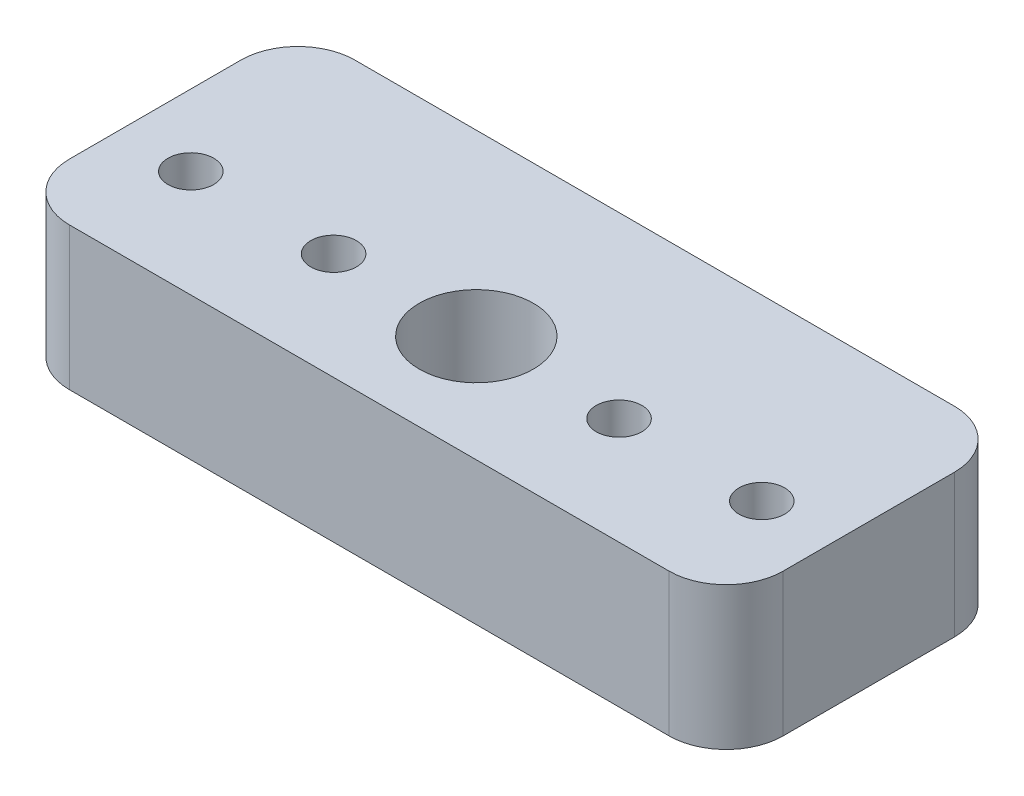
ISO-10303-21;
HEADER;
FILE_DESCRIPTION(('STEP AP214'),'2;1');
FILE_NAME('part.step','',(''),(''),'','','');
FILE_SCHEMA(('AUTOMOTIVE_DESIGN { 1 0 10303 214 1 1 1 1 }'));
ENDSEC;
DATA;
#1=APPLICATION_CONTEXT('core data for automotive mechanical design processes');
#2=APPLICATION_PROTOCOL_DEFINITION('international standard','automotive_design',2000,#1);
#3=PRODUCT_CONTEXT('',#1,'mechanical');
#4=PRODUCT('Part','Part','',(#3));
#5=PRODUCT_RELATED_PRODUCT_CATEGORY('part','',(#4));
#6=PRODUCT_DEFINITION_FORMATION('','',#4);
#7=PRODUCT_DEFINITION_CONTEXT('part definition',#1,'design');
#8=PRODUCT_DEFINITION('design','',#6,#7);
#9=PRODUCT_DEFINITION_SHAPE('','',#8);
#10=(LENGTH_UNIT() NAMED_UNIT(*) SI_UNIT(.MILLI.,.METRE.));
#11=(NAMED_UNIT(*) PLANE_ANGLE_UNIT() SI_UNIT($,.RADIAN.));
#12=(NAMED_UNIT(*) SI_UNIT($,.STERADIAN.) SOLID_ANGLE_UNIT());
#13=UNCERTAINTY_MEASURE_WITH_UNIT(LENGTH_MEASURE(1.E-05),#10,'distance_accuracy_value','');
#14=(GEOMETRIC_REPRESENTATION_CONTEXT(3) GLOBAL_UNCERTAINTY_ASSIGNED_CONTEXT((#13)) GLOBAL_UNIT_ASSIGNED_CONTEXT((#10,
#11,#12)) REPRESENTATION_CONTEXT('',''));
#15=CARTESIAN_POINT('',(0.,0.,0.));
#16=DIRECTION('',(0.,0.,1.));
#17=DIRECTION('',(1.,0.,0.));
#18=AXIS2_PLACEMENT_3D('',#15,#16,#17);
#19=CARTESIAN_POINT('',(-21.,10.,6.00000000000001));
#20=DIRECTION('',(0.,1.,0.));
#21=DIRECTION('',(0.,0.,1.));
#22=AXIS2_PLACEMENT_3D('',#19,#20,#21);
#23=PLANE('',#22);
#24=CARTESIAN_POINT('',(-20.,10.,2.5));
#25=DIRECTION('',(0.,1.,0.));
#26=DIRECTION('',(0.,0.,-1.));
#27=AXIS2_PLACEMENT_3D('',#24,#25,#26);
#28=CIRCLE('',#27,1.6);
#29=CARTESIAN_POINT('',(-20.,10.,0.900000000000001));
#30=VERTEX_POINT('',#29);
#31=EDGE_CURVE('E194',#30,#30,#28,.T.);
#32=ORIENTED_EDGE('',*,*,#31,.F.);
#33=EDGE_LOOP('',(#32));
#34=FACE_BOUND('',#33,.T.);
#35=CARTESIAN_POINT('',(10.,10.,2.50000000000002));
#36=DIRECTION('',(0.,1.,0.));
#37=DIRECTION('',(0.,0.,1.));
#38=AXIS2_PLACEMENT_3D('',#35,#36,#37);
#39=CIRCLE('',#38,1.6);
#40=CARTESIAN_POINT('',(10.,10.,4.10000000000002));
#41=VERTEX_POINT('',#40);
#42=EDGE_CURVE('E182',#41,#41,#39,.T.);
#43=ORIENTED_EDGE('',*,*,#42,.F.);
#44=EDGE_LOOP('',(#43));
#45=FACE_BOUND('',#44,.T.);
#46=CARTESIAN_POINT('',(-21.,10.,6.00000000000001));
#47=DIRECTION('',(0.,1.,0.));
#48=DIRECTION('',(0.,0.,1.));
#49=AXIS2_PLACEMENT_3D('',#46,#47,#48);
#50=CIRCLE('',#49,4.);
#51=CARTESIAN_POINT('',(-25.,10.,6.00000000000002));
#52=VERTEX_POINT('',#51);
#53=CARTESIAN_POINT('',(-21.,10.,10.));
#54=VERTEX_POINT('',#53);
#55=EDGE_CURVE('E145',#52,#54,#50,.T.);
#56=ORIENTED_EDGE('',*,*,#55,.T.);
#57=DIRECTION('',(1.,0.,0.));
#58=VECTOR('',#57,1.);
#59=CARTESIAN_POINT('',(-21.,10.,10.));
#60=LINE('',#59,#58);
#61=CARTESIAN_POINT('',(21.,10.,10.));
#62=VERTEX_POINT('',#61);
#63=EDGE_CURVE('E93',#54,#62,#60,.T.);
#64=ORIENTED_EDGE('',*,*,#63,.T.);
#65=CARTESIAN_POINT('',(21.,10.,6.00000000000001));
#66=DIRECTION('',(0.,1.,0.));
#67=DIRECTION('',(0.,0.,1.));
#68=AXIS2_PLACEMENT_3D('',#65,#66,#67);
#69=CIRCLE('',#68,4.);
#70=CARTESIAN_POINT('',(25.,10.,6.00000000000002));
#71=VERTEX_POINT('',#70);
#72=EDGE_CURVE('E160',#62,#71,#69,.T.);
#73=ORIENTED_EDGE('',*,*,#72,.T.);
#74=DIRECTION('',(0.,0.,-1.));
#75=VECTOR('',#74,1.);
#76=CARTESIAN_POINT('',(25.,10.,-5.99999999999998));
#77=LINE('',#76,#75);
#78=CARTESIAN_POINT('',(25.,10.,-5.99999999999998));
#79=VERTEX_POINT('',#78);
#80=EDGE_CURVE('E173',#71,#79,#77,.T.);
#81=ORIENTED_EDGE('',*,*,#80,.T.);
#82=CARTESIAN_POINT('',(21.,10.,-5.99999999999998));
#83=DIRECTION('',(0.,1.,0.));
#84=DIRECTION('',(0.,0.,-1.));
#85=AXIS2_PLACEMENT_3D('',#82,#83,#84);
#86=CIRCLE('',#85,4.);
#87=CARTESIAN_POINT('',(21.,10.,-9.99999999999998));
#88=VERTEX_POINT('',#87);
#89=EDGE_CURVE('E112',#79,#88,#86,.T.);
#90=ORIENTED_EDGE('',*,*,#89,.T.);
#91=DIRECTION('',(-1.,0.,0.));
#92=VECTOR('',#91,1.);
#93=CARTESIAN_POINT('',(-21.,10.,-9.99999999999998));
#94=LINE('',#93,#92);
#95=CARTESIAN_POINT('',(-21.,10.,-9.99999999999998));
#96=VERTEX_POINT('',#95);
#97=EDGE_CURVE('E106',#88,#96,#94,.T.);
#98=ORIENTED_EDGE('',*,*,#97,.T.);
#99=CARTESIAN_POINT('',(-21.,10.,-5.99999999999998));
#100=DIRECTION('',(0.,1.,0.));
#101=DIRECTION('',(0.,0.,1.));
#102=AXIS2_PLACEMENT_3D('',#99,#100,#101);
#103=CIRCLE('',#102,4.);
#104=CARTESIAN_POINT('',(-25.,10.,-5.99999999999998));
#105=VERTEX_POINT('',#104);
#106=EDGE_CURVE('E110',#96,#105,#103,.T.);
#107=ORIENTED_EDGE('',*,*,#106,.T.);
#108=DIRECTION('',(0.,0.,1.));
#109=VECTOR('',#108,1.);
#110=CARTESIAN_POINT('',(-25.,10.,-5.99999999999998));
#111=LINE('',#110,#109);
#112=EDGE_CURVE('E50',#105,#52,#111,.T.);
#113=ORIENTED_EDGE('',*,*,#112,.T.);
#114=EDGE_LOOP('',(#56,#64,#73,#81,#90,#98,#107,#113));
#115=FACE_BOUND('',#114,.T.);
#116=CARTESIAN_POINT('',(0.,10.,2.49999999999999));
#117=DIRECTION('',(0.,1.,0.));
#118=DIRECTION('',(0.,0.,1.));
#119=AXIS2_PLACEMENT_3D('',#116,#117,#118);
#120=CIRCLE('',#119,4.);
#121=CARTESIAN_POINT('',(0.,10.,6.49999999999999));
#122=VERTEX_POINT('',#121);
#123=EDGE_CURVE('E134',#122,#122,#120,.T.);
#124=ORIENTED_EDGE('',*,*,#123,.F.);
#125=EDGE_LOOP('',(#124));
#126=FACE_BOUND('',#125,.T.);
#127=CARTESIAN_POINT('',(20.,10.,2.50000000000001));
#128=DIRECTION('',(0.,1.,0.));
#129=DIRECTION('',(0.,0.,1.));
#130=AXIS2_PLACEMENT_3D('',#127,#128,#129);
#131=CIRCLE('',#130,1.60000000000001);
#132=CARTESIAN_POINT('',(20.,10.,4.10000000000002));
#133=VERTEX_POINT('',#132);
#134=EDGE_CURVE('E188',#133,#133,#131,.T.);
#135=ORIENTED_EDGE('',*,*,#134,.F.);
#136=EDGE_LOOP('',(#135));
#137=FACE_BOUND('',#136,.T.);
#138=CARTESIAN_POINT('',(-10.,10.,2.50000000000002));
#139=DIRECTION('',(0.,1.,0.));
#140=DIRECTION('',(0.,0.,-1.));
#141=AXIS2_PLACEMENT_3D('',#138,#139,#140);
#142=CIRCLE('',#141,1.6);
#143=CARTESIAN_POINT('',(-10.,10.,0.900000000000016));
#144=VERTEX_POINT('',#143);
#145=EDGE_CURVE('E200',#144,#144,#142,.T.);
#146=ORIENTED_EDGE('',*,*,#145,.F.);
#147=EDGE_LOOP('',(#146));
#148=FACE_BOUND('',#147,.T.);
#149=ADVANCED_FACE('F33',(#34,#45,#115,#126,#137,#148),#23,.T.);
#150=CARTESIAN_POINT('',(-21.,0.,6.00000000000001));
#151=DIRECTION('',(0.,1.,0.));
#152=DIRECTION('',(0.,0.,1.));
#153=AXIS2_PLACEMENT_3D('',#150,#151,#152);
#154=PLANE('',#153);
#155=CARTESIAN_POINT('',(-21.,0.,6.00000000000001));
#156=DIRECTION('',(0.,1.,0.));
#157=DIRECTION('',(0.,0.,1.));
#158=AXIS2_PLACEMENT_3D('',#155,#156,#157);
#159=CIRCLE('',#158,4.);
#160=CARTESIAN_POINT('',(-25.,0.,6.00000000000002));
#161=VERTEX_POINT('',#160);
#162=CARTESIAN_POINT('',(-21.,0.,10.));
#163=VERTEX_POINT('',#162);
#164=EDGE_CURVE('E130',#161,#163,#159,.T.);
#165=ORIENTED_EDGE('',*,*,#164,.F.);
#166=DIRECTION('',(0.,0.,1.));
#167=VECTOR('',#166,1.);
#168=CARTESIAN_POINT('',(-25.,0.,-5.99999999999998));
#169=LINE('',#168,#167);
#170=CARTESIAN_POINT('',(-25.,0.,-5.99999999999998));
#171=VERTEX_POINT('',#170);
#172=EDGE_CURVE('E85',#171,#161,#169,.T.);
#173=ORIENTED_EDGE('',*,*,#172,.F.);
#174=CARTESIAN_POINT('',(-21.,0.,-5.99999999999998));
#175=DIRECTION('',(0.,1.,0.));
#176=DIRECTION('',(0.,0.,1.));
#177=AXIS2_PLACEMENT_3D('',#174,#175,#176);
#178=CIRCLE('',#177,4.);
#179=CARTESIAN_POINT('',(-21.,0.,-9.99999999999998));
#180=VERTEX_POINT('',#179);
#181=EDGE_CURVE('E79',#180,#171,#178,.T.);
#182=ORIENTED_EDGE('',*,*,#181,.F.);
#183=DIRECTION('',(-1.,0.,0.));
#184=VECTOR('',#183,1.);
#185=CARTESIAN_POINT('',(-21.,0.,-9.99999999999998));
#186=LINE('',#185,#184);
#187=CARTESIAN_POINT('',(21.,0.,-9.99999999999998));
#188=VERTEX_POINT('',#187);
#189=EDGE_CURVE('E120',#188,#180,#186,.T.);
#190=ORIENTED_EDGE('',*,*,#189,.F.);
#191=CARTESIAN_POINT('',(21.,0.,-5.99999999999998));
#192=DIRECTION('',(0.,1.,0.));
#193=DIRECTION('',(0.,0.,-1.));
#194=AXIS2_PLACEMENT_3D('',#191,#192,#193);
#195=CIRCLE('',#194,4.);
#196=CARTESIAN_POINT('',(25.,0.,-5.99999999999998));
#197=VERTEX_POINT('',#196);
#198=EDGE_CURVE('E140',#197,#188,#195,.T.);
#199=ORIENTED_EDGE('',*,*,#198,.F.);
#200=DIRECTION('',(0.,0.,-1.));
#201=VECTOR('',#200,1.);
#202=CARTESIAN_POINT('',(25.,0.,-5.99999999999998));
#203=LINE('',#202,#201);
#204=CARTESIAN_POINT('',(25.,0.,6.00000000000002));
#205=VERTEX_POINT('',#204);
#206=EDGE_CURVE('E138',#205,#197,#203,.T.);
#207=ORIENTED_EDGE('',*,*,#206,.F.);
#208=CARTESIAN_POINT('',(21.,0.,6.00000000000001));
#209=DIRECTION('',(0.,1.,0.));
#210=DIRECTION('',(0.,0.,1.));
#211=AXIS2_PLACEMENT_3D('',#208,#209,#210);
#212=CIRCLE('',#211,4.);
#213=CARTESIAN_POINT('',(21.,0.,10.));
#214=VERTEX_POINT('',#213);
#215=EDGE_CURVE('E136',#214,#205,#212,.T.);
#216=ORIENTED_EDGE('',*,*,#215,.F.);
#217=DIRECTION('',(1.,0.,0.));
#218=VECTOR('',#217,1.);
#219=CARTESIAN_POINT('',(-21.,0.,10.));
#220=LINE('',#219,#218);
#221=EDGE_CURVE('E133',#163,#214,#220,.T.);
#222=ORIENTED_EDGE('',*,*,#221,.F.);
#223=EDGE_LOOP('',(#165,#173,#182,#190,#199,#207,#216,#222));
#224=FACE_BOUND('',#223,.T.);
#225=CARTESIAN_POINT('',(0.,0.,2.49999999999999));
#226=DIRECTION('',(0.,1.,0.));
#227=DIRECTION('',(0.,0.,1.));
#228=AXIS2_PLACEMENT_3D('',#225,#226,#227);
#229=CIRCLE('',#228,4.);
#230=CARTESIAN_POINT('',(0.,0.,6.49999999999999));
#231=VERTEX_POINT('',#230);
#232=EDGE_CURVE('E179',#231,#231,#229,.T.);
#233=ORIENTED_EDGE('',*,*,#232,.T.);
#234=EDGE_LOOP('',(#233));
#235=FACE_BOUND('',#234,.T.);
#236=CARTESIAN_POINT('',(10.,0.,2.50000000000002));
#237=DIRECTION('',(0.,1.,0.));
#238=DIRECTION('',(0.,0.,1.));
#239=AXIS2_PLACEMENT_3D('',#236,#237,#238);
#240=CIRCLE('',#239,1.6);
#241=CARTESIAN_POINT('',(10.,0.,4.10000000000002));
#242=VERTEX_POINT('',#241);
#243=EDGE_CURVE('E185',#242,#242,#240,.T.);
#244=ORIENTED_EDGE('',*,*,#243,.T.);
#245=EDGE_LOOP('',(#244));
#246=FACE_BOUND('',#245,.T.);
#247=CARTESIAN_POINT('',(20.,0.,2.50000000000001));
#248=DIRECTION('',(0.,1.,0.));
#249=DIRECTION('',(0.,0.,1.));
#250=AXIS2_PLACEMENT_3D('',#247,#248,#249);
#251=CIRCLE('',#250,1.60000000000001);
#252=CARTESIAN_POINT('',(20.,0.,4.10000000000002));
#253=VERTEX_POINT('',#252);
#254=EDGE_CURVE('E191',#253,#253,#251,.T.);
#255=ORIENTED_EDGE('',*,*,#254,.T.);
#256=EDGE_LOOP('',(#255));
#257=FACE_BOUND('',#256,.T.);
#258=CARTESIAN_POINT('',(-20.,0.,2.5));
#259=DIRECTION('',(0.,1.,0.));
#260=DIRECTION('',(0.,0.,-1.));
#261=AXIS2_PLACEMENT_3D('',#258,#259,#260);
#262=CIRCLE('',#261,1.6);
#263=CARTESIAN_POINT('',(-20.,0.,0.900000000000001));
#264=VERTEX_POINT('',#263);
#265=EDGE_CURVE('E197',#264,#264,#262,.T.);
#266=ORIENTED_EDGE('',*,*,#265,.T.);
#267=EDGE_LOOP('',(#266));
#268=FACE_BOUND('',#267,.T.);
#269=CARTESIAN_POINT('',(-10.,0.,2.50000000000002));
#270=DIRECTION('',(0.,1.,0.));
#271=DIRECTION('',(0.,0.,-1.));
#272=AXIS2_PLACEMENT_3D('',#269,#270,#271);
#273=CIRCLE('',#272,1.6);
#274=CARTESIAN_POINT('',(-10.,0.,0.900000000000016));
#275=VERTEX_POINT('',#274);
#276=EDGE_CURVE('E203',#275,#275,#273,.T.);
#277=ORIENTED_EDGE('',*,*,#276,.T.);
#278=EDGE_LOOP('',(#277));
#279=FACE_BOUND('',#278,.T.);
#280=ADVANCED_FACE('F164',(#224,#235,#246,#257,#268,#279),#154,.F.);
#281=CARTESIAN_POINT('',(-21.,10.,6.00000000000001));
#282=DIRECTION('',(0.,-1.,0.));
#283=DIRECTION('',(0.,0.,-1.));
#284=AXIS2_PLACEMENT_3D('',#281,#282,#283);
#285=CYLINDRICAL_SURFACE('',#284,4.);
#286=ORIENTED_EDGE('',*,*,#164,.T.);
#287=DIRECTION('',(0.,-1.,0.));
#288=VECTOR('',#287,1.);
#289=CARTESIAN_POINT('',(-21.,10.,10.));
#290=LINE('',#289,#288);
#291=EDGE_CURVE('E11',#54,#163,#290,.T.);
#292=ORIENTED_EDGE('',*,*,#291,.F.);
#293=ORIENTED_EDGE('',*,*,#55,.F.);
#294=DIRECTION('',(0.,-1.,0.));
#295=VECTOR('',#294,1.);
#296=CARTESIAN_POINT('',(-25.,10.,6.00000000000002));
#297=LINE('',#296,#295);
#298=EDGE_CURVE('E126',#52,#161,#297,.T.);
#299=ORIENTED_EDGE('',*,*,#298,.T.);
#300=EDGE_LOOP('',(#286,#292,#293,#299));
#301=FACE_BOUND('',#300,.T.);
#302=ADVANCED_FACE('F35',(#301),#285,.T.);
#303=CARTESIAN_POINT('',(-21.,10.,10.));
#304=DIRECTION('',(0.,0.,-1.));
#305=DIRECTION('',(-1.,0.,0.));
#306=AXIS2_PLACEMENT_3D('',#303,#304,#305);
#307=PLANE('',#306);
#308=ORIENTED_EDGE('',*,*,#221,.T.);
#309=DIRECTION('',(0.,-1.,0.));
#310=VECTOR('',#309,1.);
#311=CARTESIAN_POINT('',(21.,10.,10.));
#312=LINE('',#311,#310);
#313=EDGE_CURVE('E42',#62,#214,#312,.T.);
#314=ORIENTED_EDGE('',*,*,#313,.F.);
#315=ORIENTED_EDGE('',*,*,#63,.F.);
#316=ORIENTED_EDGE('',*,*,#291,.T.);
#317=EDGE_LOOP('',(#308,#314,#315,#316));
#318=FACE_BOUND('',#317,.T.);
#319=ADVANCED_FACE('F237',(#318),#307,.F.);
#320=CARTESIAN_POINT('',(21.,10.,6.00000000000001));
#321=DIRECTION('',(0.,-1.,0.));
#322=DIRECTION('',(0.,0.,-1.));
#323=AXIS2_PLACEMENT_3D('',#320,#321,#322);
#324=CYLINDRICAL_SURFACE('',#323,4.);
#325=ORIENTED_EDGE('',*,*,#215,.T.);
#326=DIRECTION('',(0.,-1.,0.));
#327=VECTOR('',#326,1.);
#328=CARTESIAN_POINT('',(25.,10.,6.00000000000002));
#329=LINE('',#328,#327);
#330=EDGE_CURVE('E152',#71,#205,#329,.T.);
#331=ORIENTED_EDGE('',*,*,#330,.F.);
#332=ORIENTED_EDGE('',*,*,#72,.F.);
#333=ORIENTED_EDGE('',*,*,#313,.T.);
#334=EDGE_LOOP('',(#325,#331,#332,#333));
#335=FACE_BOUND('',#334,.T.);
#336=ADVANCED_FACE('F158',(#335),#324,.T.);
#337=CARTESIAN_POINT('',(25.,10.,-5.99999999999998));
#338=DIRECTION('',(-1.,0.,0.));
#339=DIRECTION('',(0.,0.,1.));
#340=AXIS2_PLACEMENT_3D('',#337,#338,#339);
#341=PLANE('',#340);
#342=ORIENTED_EDGE('',*,*,#206,.T.);
#343=DIRECTION('',(0.,-1.,0.));
#344=VECTOR('',#343,1.);
#345=CARTESIAN_POINT('',(25.,10.,-5.99999999999998));
#346=LINE('',#345,#344);
#347=EDGE_CURVE('E149',#79,#197,#346,.T.);
#348=ORIENTED_EDGE('',*,*,#347,.F.);
#349=ORIENTED_EDGE('',*,*,#80,.F.);
#350=ORIENTED_EDGE('',*,*,#330,.T.);
#351=EDGE_LOOP('',(#342,#348,#349,#350));
#352=FACE_BOUND('',#351,.T.);
#353=ADVANCED_FACE('F169',(#352),#341,.F.);
#354=CARTESIAN_POINT('',(21.,10.,-5.99999999999998));
#355=DIRECTION('',(0.,-1.,0.));
#356=DIRECTION('',(0.,0.,-1.));
#357=AXIS2_PLACEMENT_3D('',#354,#355,#356);
#358=CYLINDRICAL_SURFACE('',#357,4.);
#359=ORIENTED_EDGE('',*,*,#198,.T.);
#360=DIRECTION('',(0.,-1.,0.));
#361=VECTOR('',#360,1.);
#362=CARTESIAN_POINT('',(21.,10.,-9.99999999999998));
#363=LINE('',#362,#361);
#364=EDGE_CURVE('E121',#88,#188,#363,.T.);
#365=ORIENTED_EDGE('',*,*,#364,.F.);
#366=ORIENTED_EDGE('',*,*,#89,.F.);
#367=ORIENTED_EDGE('',*,*,#347,.T.);
#368=EDGE_LOOP('',(#359,#365,#366,#367));
#369=FACE_BOUND('',#368,.T.);
#370=ADVANCED_FACE('F172',(#369),#358,.T.);
#371=CARTESIAN_POINT('',(-21.,10.,-9.99999999999998));
#372=DIRECTION('',(0.,0.,1.));
#373=DIRECTION('',(1.,0.,0.));
#374=AXIS2_PLACEMENT_3D('',#371,#372,#373);
#375=PLANE('',#374);
#376=ORIENTED_EDGE('',*,*,#189,.T.);
#377=DIRECTION('',(0.,-1.,0.));
#378=VECTOR('',#377,1.);
#379=CARTESIAN_POINT('',(-21.,10.,-9.99999999999998));
#380=LINE('',#379,#378);
#381=EDGE_CURVE('E117',#96,#180,#380,.T.);
#382=ORIENTED_EDGE('',*,*,#381,.F.);
#383=ORIENTED_EDGE('',*,*,#97,.F.);
#384=ORIENTED_EDGE('',*,*,#364,.T.);
#385=EDGE_LOOP('',(#376,#382,#383,#384));
#386=FACE_BOUND('',#385,.T.);
#387=ADVANCED_FACE('F118',(#386),#375,.F.);
#388=CARTESIAN_POINT('',(-21.,10.,-5.99999999999998));
#389=DIRECTION('',(0.,-1.,0.));
#390=DIRECTION('',(0.,0.,-1.));
#391=AXIS2_PLACEMENT_3D('',#388,#389,#390);
#392=CYLINDRICAL_SURFACE('',#391,4.);
#393=ORIENTED_EDGE('',*,*,#181,.T.);
#394=DIRECTION('',(0.,-1.,0.));
#395=VECTOR('',#394,1.);
#396=CARTESIAN_POINT('',(-25.,10.,-5.99999999999998));
#397=LINE('',#396,#395);
#398=EDGE_CURVE('E122',#105,#171,#397,.T.);
#399=ORIENTED_EDGE('',*,*,#398,.F.);
#400=ORIENTED_EDGE('',*,*,#106,.F.);
#401=ORIENTED_EDGE('',*,*,#381,.T.);
#402=EDGE_LOOP('',(#393,#399,#400,#401));
#403=FACE_BOUND('',#402,.T.);
#404=ADVANCED_FACE('F124',(#403),#392,.T.);
#405=CARTESIAN_POINT('',(-25.,10.,-5.99999999999998));
#406=DIRECTION('',(1.,0.,0.));
#407=DIRECTION('',(0.,0.,-1.));
#408=AXIS2_PLACEMENT_3D('',#405,#406,#407);
#409=PLANE('',#408);
#410=ORIENTED_EDGE('',*,*,#172,.T.);
#411=ORIENTED_EDGE('',*,*,#298,.F.);
#412=ORIENTED_EDGE('',*,*,#112,.F.);
#413=ORIENTED_EDGE('',*,*,#398,.T.);
#414=EDGE_LOOP('',(#410,#411,#412,#413));
#415=FACE_BOUND('',#414,.T.);
#416=ADVANCED_FACE('F225',(#415),#409,.F.);
#417=CARTESIAN_POINT('',(0.,10.,2.49999999999999));
#418=DIRECTION('',(0.,-1.,0.));
#419=DIRECTION('',(0.,0.,-1.));
#420=AXIS2_PLACEMENT_3D('',#417,#418,#419);
#421=CYLINDRICAL_SURFACE('',#420,4.);
#422=ORIENTED_EDGE('',*,*,#123,.T.);
#423=EDGE_LOOP('',(#422));
#424=FACE_BOUND('',#423,.T.);
#425=ORIENTED_EDGE('',*,*,#232,.F.);
#426=EDGE_LOOP('',(#425));
#427=FACE_BOUND('',#426,.T.);
#428=ADVANCED_FACE('F222',(#424,#427),#421,.F.);
#429=CARTESIAN_POINT('',(10.,10.,2.50000000000002));
#430=DIRECTION('',(0.,-1.,0.));
#431=DIRECTION('',(0.,0.,-1.));
#432=AXIS2_PLACEMENT_3D('',#429,#430,#431);
#433=CYLINDRICAL_SURFACE('',#432,1.6);
#434=ORIENTED_EDGE('',*,*,#42,.T.);
#435=EDGE_LOOP('',(#434));
#436=FACE_BOUND('',#435,.T.);
#437=ORIENTED_EDGE('',*,*,#243,.F.);
#438=EDGE_LOOP('',(#437));
#439=FACE_BOUND('',#438,.T.);
#440=ADVANCED_FACE('F301',(#436,#439),#433,.F.);
#441=CARTESIAN_POINT('',(20.,10.,2.50000000000001));
#442=DIRECTION('',(0.,-1.,0.));
#443=DIRECTION('',(0.,0.,-1.));
#444=AXIS2_PLACEMENT_3D('',#441,#442,#443);
#445=CYLINDRICAL_SURFACE('',#444,1.60000000000001);
#446=ORIENTED_EDGE('',*,*,#134,.T.);
#447=EDGE_LOOP('',(#446));
#448=FACE_BOUND('',#447,.T.);
#449=ORIENTED_EDGE('',*,*,#254,.F.);
#450=EDGE_LOOP('',(#449));
#451=FACE_BOUND('',#450,.T.);
#452=ADVANCED_FACE('F309',(#448,#451),#445,.F.);
#453=CARTESIAN_POINT('',(-20.,10.,2.5));
#454=DIRECTION('',(0.,-1.,0.));
#455=DIRECTION('',(0.,0.,-1.));
#456=AXIS2_PLACEMENT_3D('',#453,#454,#455);
#457=CYLINDRICAL_SURFACE('',#456,1.6);
#458=ORIENTED_EDGE('',*,*,#31,.T.);
#459=EDGE_LOOP('',(#458));
#460=FACE_BOUND('',#459,.T.);
#461=ORIENTED_EDGE('',*,*,#265,.F.);
#462=EDGE_LOOP('',(#461));
#463=FACE_BOUND('',#462,.T.);
#464=ADVANCED_FACE('F317',(#460,#463),#457,.F.);
#465=CARTESIAN_POINT('',(-10.,10.,2.50000000000002));
#466=DIRECTION('',(0.,-1.,0.));
#467=DIRECTION('',(0.,0.,-1.));
#468=AXIS2_PLACEMENT_3D('',#465,#466,#467);
#469=CYLINDRICAL_SURFACE('',#468,1.6);
#470=ORIENTED_EDGE('',*,*,#145,.T.);
#471=EDGE_LOOP('',(#470));
#472=FACE_BOUND('',#471,.T.);
#473=ORIENTED_EDGE('',*,*,#276,.F.);
#474=EDGE_LOOP('',(#473));
#475=FACE_BOUND('',#474,.T.);
#476=ADVANCED_FACE('F209',(#472,#475),#469,.F.);
#477=CLOSED_SHELL('',(#149,#280,#302,#319,#336,#353,#370,#387,#404,#416,#428,#440,#452,#464,#476));
#478=MANIFOLD_SOLID_BREP('B2',#477);
#479=ADVANCED_BREP_SHAPE_REPRESENTATION('',(#18,#478),#14);
#480=SHAPE_DEFINITION_REPRESENTATION(#9,#479);
ENDSEC;
END-ISO-10303-21;
